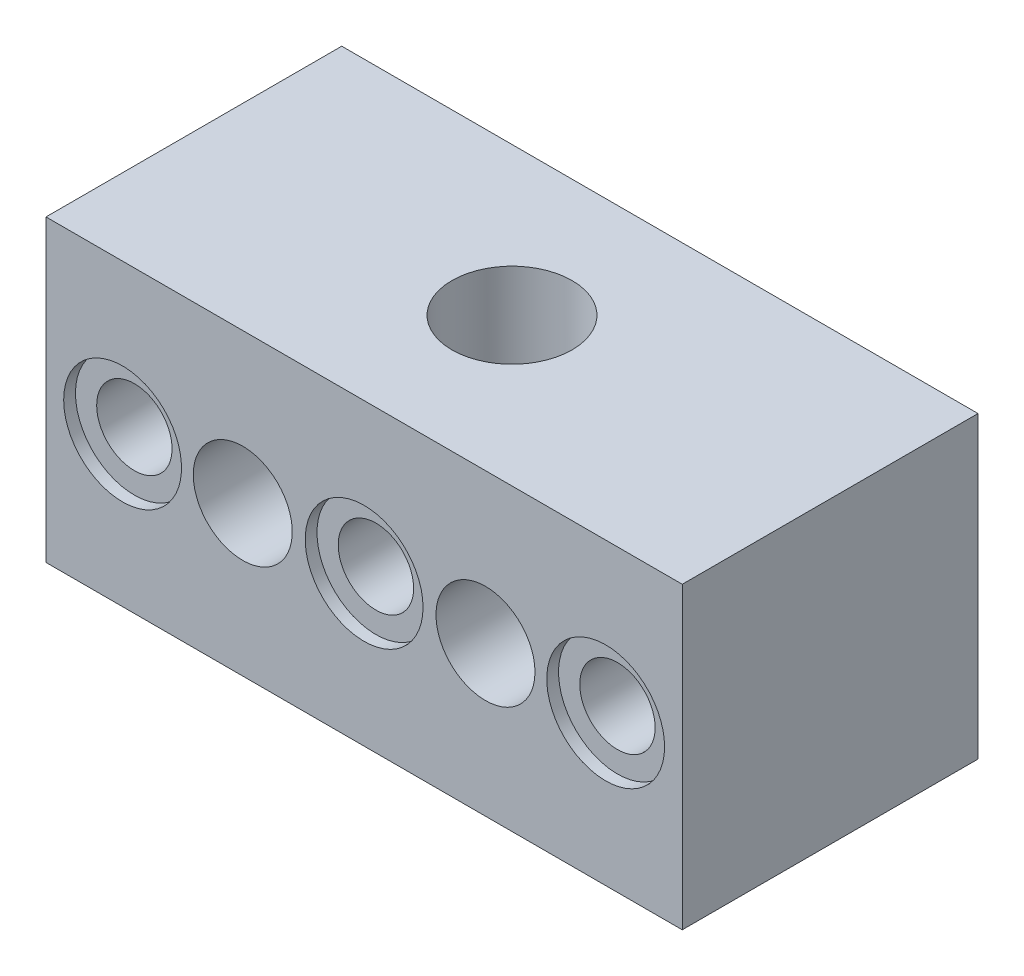
ISO-10303-21;
HEADER;
FILE_DESCRIPTION(('STEP AP214'),'2;1');
FILE_NAME('part.step','',(''),(''),'','','');
FILE_SCHEMA(('AUTOMOTIVE_DESIGN { 1 0 10303 214 1 1 1 1 }'));
ENDSEC;
DATA;
#1=APPLICATION_CONTEXT('core data for automotive mechanical design processes');
#2=APPLICATION_PROTOCOL_DEFINITION('international standard','automotive_design',2000,#1);
#3=PRODUCT_CONTEXT('',#1,'mechanical');
#4=PRODUCT('Part','Part','',(#3));
#5=PRODUCT_RELATED_PRODUCT_CATEGORY('part','',(#4));
#6=PRODUCT_DEFINITION_FORMATION('','',#4);
#7=PRODUCT_DEFINITION_CONTEXT('part definition',#1,'design');
#8=PRODUCT_DEFINITION('design','',#6,#7);
#9=PRODUCT_DEFINITION_SHAPE('','',#8);
#10=(LENGTH_UNIT() NAMED_UNIT(*) SI_UNIT(.MILLI.,.METRE.));
#11=(NAMED_UNIT(*) PLANE_ANGLE_UNIT() SI_UNIT($,.RADIAN.));
#12=(NAMED_UNIT(*) SI_UNIT($,.STERADIAN.) SOLID_ANGLE_UNIT());
#13=UNCERTAINTY_MEASURE_WITH_UNIT(LENGTH_MEASURE(1.E-05),#10,'distance_accuracy_value','');
#14=(GEOMETRIC_REPRESENTATION_CONTEXT(3) GLOBAL_UNCERTAINTY_ASSIGNED_CONTEXT((#13)) GLOBAL_UNIT_ASSIGNED_CONTEXT((#10,
#11,#12)) REPRESENTATION_CONTEXT('',''));
#15=CARTESIAN_POINT('',(0.,0.,0.));
#16=DIRECTION('',(0.,0.,1.));
#17=DIRECTION('',(1.,0.,0.));
#18=AXIS2_PLACEMENT_3D('',#15,#16,#17);
#19=CARTESIAN_POINT('',(0.,0.,-12.55));
#20=DIRECTION('',(0.,0.,1.));
#21=DIRECTION('',(1.,0.,0.));
#22=AXIS2_PLACEMENT_3D('',#19,#20,#21);
#23=CYLINDRICAL_SURFACE('',#22,2.);
#24=CARTESIAN_POINT('',(2.,0.,-4.69148164229596));
#25=CARTESIAN_POINT('',(1.99998868294407,-0.107331527160805,-4.69149190499258));
#26=CARTESIAN_POINT('',(1.99130845931353,-0.214825531204384,-4.69521685162323));
#27=CARTESIAN_POINT('',(1.95690529886903,-0.426741592262692,-4.70965465194673));
#28=CARTESIAN_POINT('',(1.93113779598547,-0.53115486850916,-4.72038577762299));
#29=CARTESIAN_POINT('',(1.86368433406458,-0.73348942458071,-4.74741888303735));
#30=CARTESIAN_POINT('',(1.82205688790874,-0.831433033061049,-4.76370036261289));
#31=CARTESIAN_POINT('',(1.7242353393972,-1.01892137459719,-4.79997107957712));
#32=CARTESIAN_POINT('',(1.66804483796129,-1.10846817643796,-4.81995940005034));
#33=CARTESIAN_POINT('',(1.53938855784149,-1.281594216585,-4.8626219141422));
#34=CARTESIAN_POINT('',(1.46625161521045,-1.36465417687144,-4.88538029304905));
#35=CARTESIAN_POINT('',(1.30719248057609,-1.51770732900037,-4.9303218134644));
#36=CARTESIAN_POINT('',(1.2212659278244,-1.5876960456447,-4.95250475573069));
#37=CARTESIAN_POINT('',(1.03508782493009,-1.71516401056526,-4.99480036084807));
#38=CARTESIAN_POINT('',(0.934418656167721,-1.77207287368724,-5.01480359223439));
#39=CARTESIAN_POINT('',(0.724011817736552,-1.86792827658748,-5.04947027049336));
#40=CARTESIAN_POINT('',(0.614277722882891,-1.90688185765342,-5.06413581010314));
#41=CARTESIAN_POINT('',(0.394296302938079,-1.96388137626348,-5.08587928803576));
#42=CARTESIAN_POINT('',(0.284312625478473,-1.98281932757034,-5.09327979234115));
#43=CARTESIAN_POINT('',(0.0624960996866547,-2.00211777551243,-5.10082260659717));
#44=CARTESIAN_POINT('',(-0.0493360723678362,-2.002484922169,-5.1009675147048));
#45=CARTESIAN_POINT('',(-0.265244397565637,-1.98513018349094,-5.09418197279688));
#46=CARTESIAN_POINT('',(-0.369413163792085,-1.96838449155716,-5.08763334803136));
#47=CARTESIAN_POINT('',(-0.573324970423759,-1.91893396861578,-5.0687067807809));
#48=CARTESIAN_POINT('',(-0.673067686619219,-1.88622797060826,-5.05632841203385));
#49=CARTESIAN_POINT('',(-0.867073247446061,-1.80537987200519,-5.02672510845319));
#50=CARTESIAN_POINT('',(-0.961231976251247,-1.75701448414259,-5.00943053749082));
#51=CARTESIAN_POINT('',(-1.14033744605734,-1.6464258295747,-4.97172199977939));
#52=CARTESIAN_POINT('',(-1.22528107030746,-1.5841978958463,-4.95130698321618));
#53=CARTESIAN_POINT('',(-1.38925998094188,-1.4430482235682,-4.90791218815722));
#54=CARTESIAN_POINT('',(-1.46757929571857,-1.36331825468459,-4.8848518630633));
#55=CARTESIAN_POINT('',(-1.61002157465662,-1.19174982368722,-4.83977527079559));
#56=CARTESIAN_POINT('',(-1.67414025179845,-1.09990771836404,-4.81775932047925));
#57=CARTESIAN_POINT('',(-1.78791056883542,-0.903642216809712,-4.77672905622578));
#58=CARTESIAN_POINT('',(-1.83713849403592,-0.798951945351058,-4.75780865273447));
#59=CARTESIAN_POINT('',(-1.91698539446833,-0.581828215474679,-4.72620704743673));
#60=CARTESIAN_POINT('',(-1.94761589932275,-0.46939960274362,-4.71352198091306));
#61=CARTESIAN_POINT('',(-1.98769301802243,-0.247113567350298,-4.69675670897121));
#62=CARTESIAN_POINT('',(-1.99828740977897,-0.137498588992224,-4.69221113144169));
#63=CARTESIAN_POINT('',(-2.00132774366452,0.0820131950800572,-4.6909162055166));
#64=CARTESIAN_POINT('',(-1.99377886278772,0.191909911464717,-4.69416463318225));
#65=CARTESIAN_POINT('',(-1.96179069252149,0.402651214593438,-4.70761564154756));
#66=CARTESIAN_POINT('',(-1.93828265431958,0.503664607054172,-4.71743439869375));
#67=CARTESIAN_POINT('',(-1.87623986945062,0.700253130200314,-4.74245026892945));
#68=CARTESIAN_POINT('',(-1.83770187180447,0.795827079205912,-4.75764854554285));
#69=CARTESIAN_POINT('',(-1.74498344049006,0.983044096995232,-4.79244929911338));
#70=CARTESIAN_POINT('',(-1.69024357960678,1.07438124343816,-4.8122024559605));
#71=CARTESIAN_POINT('',(-1.56725447396231,1.24697750470173,-4.85365014102031));
#72=CARTESIAN_POINT('',(-1.49899989868237,1.3282326222986,-4.8753454334007));
#73=CARTESIAN_POINT('',(-1.34523607964226,1.48430655128741,-4.92007950698364));
#74=CARTESIAN_POINT('',(-1.25884983966185,1.55826825021946,-4.94310522156386));
#75=CARTESIAN_POINT('',(-1.07433650791887,1.69076875594337,-4.9864587903578));
#76=CARTESIAN_POINT('',(-0.976209091868441,1.74930713660464,-5.00678657002262));
#77=CARTESIAN_POINT('',(-0.770794259812777,1.84902293904313,-5.04249098344998));
#78=CARTESIAN_POINT('',(-0.663519582451274,1.89022404507421,-5.05787436486452));
#79=CARTESIAN_POINT('',(-0.442813401403255,1.95373580715787,-5.0819494679434));
#80=CARTESIAN_POINT('',(-0.32938512717185,1.97605627179124,-5.0906446639379));
#81=CARTESIAN_POINT('',(-0.107303036580069,2.00004175556764,-5.1000056753124));
#82=CARTESIAN_POINT('',(0.00120087864374591,2.0029204055287,-5.10114319093159));
#83=CARTESIAN_POINT('',(0.217088154673384,1.99111889061257,-5.09652075232563));
#84=CARTESIAN_POINT('',(0.324471671719407,1.97644120790183,-5.09076177314727));
#85=CARTESIAN_POINT('',(0.531926712803004,1.93080729294376,-5.0732231752267));
#86=CARTESIAN_POINT('',(0.632119562125606,1.90032918647124,-5.06162066271493));
#87=CARTESIAN_POINT('',(0.82596011567325,1.82445317703445,-5.03362592455541));
#88=CARTESIAN_POINT('',(0.91960658685429,1.7790524724553,-5.01723279956735));
#89=CARTESIAN_POINT('',(1.10217876099081,1.67238266764866,-4.98038692972038));
#90=CARTESIAN_POINT('',(1.19072059473513,1.61050798670954,-4.95978834290144));
#91=CARTESIAN_POINT('',(1.35652898984138,1.47356716799083,-4.9170289361656));
#92=CARTESIAN_POINT('',(1.43379112620366,1.39849587853038,-4.89486750817877));
#93=CARTESIAN_POINT('',(1.57955379086658,1.2320539533079,-4.84986296767393));
#94=CARTESIAN_POINT('',(1.64726880026457,1.13998313142366,-4.82705674018374));
#95=CARTESIAN_POINT('',(1.76633116568977,0.94504331183851,-4.78477634630386));
#96=CARTESIAN_POINT('',(1.81767632497243,0.842172867347297,-4.76530262728092));
#97=CARTESIAN_POINT('',(1.89850491661755,0.637724461783185,-4.73364531877403));
#98=CARTESIAN_POINT('',(1.92950879423484,0.536821861378337,-4.72097274098538));
#99=CARTESIAN_POINT('',(1.97521941832933,0.330990262028884,-4.70203619691373));
#100=CARTESIAN_POINT('',(1.98997215188218,0.226073498569593,-4.69575415074687));
#101=CARTESIAN_POINT('',(1.9987879428241,0.0805247888119468,-4.69199695441099));
#102=CARTESIAN_POINT('',(2.00000424648029,0.0402738324794917,-4.69147779144118));
#103=CARTESIAN_POINT('',(2.,0.,-4.69148164229596));
#104=B_SPLINE_CURVE_WITH_KNOTS('',3,(#24,#25,#26,#27,#28,#29,#30,#31,#32,#33,#34,#35,#36,#37,
#38,#39,#40,#41,#42,#43,#44,#45,#46,#47,#48,#49,#50,#51,#52,#53,#54,#55,#56,#57,#58,#59,#60,#61,
#62,#63,#64,#65,#66,#67,#68,#69,#70,#71,#72,#73,#74,#75,#76,#77,#78,#79,#80,#81,#82,#83,#84,#85,
#86,#87,#88,#89,#90,#91,#92,#93,#94,#95,#96,#97,#98,#99,#100,#101,#102,#103),.UNSPECIFIED.,.T.,
.F.,(4,2,2,2,2,2,2,2,2,2,2,2,2,2,2,2,2,2,2,2,2,2,2,2,2,2,2,2,2,2,2,2,2,2,2,2,2,2,2,4),(0.,
0.321873118007116,0.644589046409371,0.966125714661647,1.28758295418594,1.62504906019072,
1.96263049341685,2.3129255336373,2.66308308612496,2.99687651402516,3.33055041295608,
3.64619748634823,3.96186764296412,4.28225330021832,4.6027469833052,4.94355894733683,
5.28447365900743,5.6343330458018,5.9839753123505,6.3128980344958,6.64172691310554,
6.95285184348961,7.2640441075293,7.58756997964854,7.91122371302847,8.25768589219792,
8.60415764276125,8.95015453343389,9.29597156653151,9.61998414605211,9.94395092112635,
10.2586417715133,10.5733917367164,10.9018654237185,11.2304676259244,11.5784506402441,
11.9264803323489,12.2440397048368,12.560698128854,12.6814740497524),.UNSPECIFIED.);
#105=CARTESIAN_POINT('',(2.,0.,-4.69148164229596));
#106=VERTEX_POINT('',#105);
#107=EDGE_CURVE('E246',#106,#106,#104,.T.);
#108=ORIENTED_EDGE('',*,*,#107,.F.);
#109=EDGE_LOOP('',(#108));
#110=FACE_BOUND('',#109,.T.);
#111=CARTESIAN_POINT('',(0.,0.,-6.95));
#112=DIRECTION('',(0.,0.,-1.));
#113=DIRECTION('',(-1.,0.,0.));
#114=AXIS2_PLACEMENT_3D('',#111,#112,#113);
#115=CIRCLE('',#114,2.);
#116=CARTESIAN_POINT('',(-2.,0.,-6.95));
#117=VERTEX_POINT('',#116);
#118=EDGE_CURVE('E51',#117,#117,#115,.F.);
#119=ORIENTED_EDGE('',*,*,#118,.F.);
#120=EDGE_LOOP('',(#119));
#121=FACE_BOUND('',#120,.T.);
#122=ADVANCED_FACE('F47',(#110,#121),#23,.F.);
#123=CARTESIAN_POINT('',(0.,0.,-11.55));
#124=DIRECTION('',(0.,0.,-1.));
#125=DIRECTION('',(1.,0.,0.));
#126=AXIS2_PLACEMENT_3D('',#123,#124,#125);
#127=PLANE('',#126);
#128=CARTESIAN_POINT('',(0.,0.,-11.55));
#129=DIRECTION('',(0.,0.,1.));
#130=DIRECTION('',(1.,0.,0.));
#131=AXIS2_PLACEMENT_3D('',#128,#129,#130);
#132=CIRCLE('',#131,5.);
#133=CARTESIAN_POINT('',(5.,0.,-11.55));
#134=VERTEX_POINT('',#133);
#135=EDGE_CURVE('E251',#134,#134,#132,.T.);
#136=ORIENTED_EDGE('',*,*,#135,.F.);
#137=EDGE_LOOP('',(#136));
#138=FACE_BOUND('',#137,.T.);
#139=CARTESIAN_POINT('',(0.,0.,-11.55));
#140=DIRECTION('',(0.,0.,1.));
#141=DIRECTION('',(1.,0.,0.));
#142=AXIS2_PLACEMENT_3D('',#139,#140,#141);
#143=CIRCLE('',#142,3.2);
#144=CARTESIAN_POINT('',(3.2,0.,-11.55));
#145=VERTEX_POINT('',#144);
#146=EDGE_CURVE('E390',#145,#145,#143,.T.);
#147=ORIENTED_EDGE('',*,*,#146,.T.);
#148=EDGE_LOOP('',(#147));
#149=FACE_BOUND('',#148,.T.);
#150=ADVANCED_FACE('F211',(#138,#149),#127,.T.);
#151=CARTESIAN_POINT('',(0.,0.,-12.55));
#152=DIRECTION('',(0.,0.,-1.));
#153=DIRECTION('',(-1.,0.,0.));
#154=AXIS2_PLACEMENT_3D('',#151,#152,#153);
#155=PLANE('',#154);
#156=CARTESIAN_POINT('',(-20.5,0.,-12.55));
#157=DIRECTION('',(0.,0.,1.));
#158=DIRECTION('',(-1.,0.,0.));
#159=AXIS2_PLACEMENT_3D('',#156,#157,#158);
#160=CIRCLE('',#159,5.);
#161=CARTESIAN_POINT('',(-25.5,0.,-12.55));
#162=VERTEX_POINT('',#161);
#163=EDGE_CURVE('E127',#162,#162,#160,.T.);
#164=ORIENTED_EDGE('',*,*,#163,.T.);
#165=EDGE_LOOP('',(#164));
#166=FACE_BOUND('',#165,.T.);
#167=DIRECTION('',(0.,-1.,0.));
#168=VECTOR('',#167,1.);
#169=CARTESIAN_POINT('',(-27.,12.7,-12.55));
#170=LINE('',#169,#168);
#171=CARTESIAN_POINT('',(-27.,12.7,-12.55));
#172=VERTEX_POINT('',#171);
#173=CARTESIAN_POINT('',(-27.,-12.7,-12.55));
#174=VERTEX_POINT('',#173);
#175=EDGE_CURVE('E90',#172,#174,#170,.T.);
#176=ORIENTED_EDGE('',*,*,#175,.F.);
#177=DIRECTION('',(-1.,0.,0.));
#178=VECTOR('',#177,1.);
#179=CARTESIAN_POINT('',(27.,12.7,-12.55));
#180=LINE('',#179,#178);
#181=CARTESIAN_POINT('',(27.,12.7,-12.55));
#182=VERTEX_POINT('',#181);
#183=EDGE_CURVE('E95',#182,#172,#180,.T.);
#184=ORIENTED_EDGE('',*,*,#183,.F.);
#185=DIRECTION('',(0.,1.,0.));
#186=VECTOR('',#185,1.);
#187=CARTESIAN_POINT('',(27.,12.7,-12.55));
#188=LINE('',#187,#186);
#189=CARTESIAN_POINT('',(27.,-12.7,-12.55));
#190=VERTEX_POINT('',#189);
#191=EDGE_CURVE('E120',#190,#182,#188,.T.);
#192=ORIENTED_EDGE('',*,*,#191,.F.);
#193=DIRECTION('',(1.,0.,0.));
#194=VECTOR('',#193,1.);
#195=CARTESIAN_POINT('',(27.,-12.7,-12.55));
#196=LINE('',#195,#194);
#197=EDGE_CURVE('E118',#174,#190,#196,.T.);
#198=ORIENTED_EDGE('',*,*,#197,.F.);
#199=EDGE_LOOP('',(#176,#184,#192,#198));
#200=FACE_BOUND('',#199,.T.);
#201=CARTESIAN_POINT('',(20.5,0.,-12.55));
#202=DIRECTION('',(0.,0.,1.));
#203=DIRECTION('',(1.,0.,0.));
#204=AXIS2_PLACEMENT_3D('',#201,#202,#203);
#205=CIRCLE('',#204,5.);
#206=CARTESIAN_POINT('',(25.5,0.,-12.55));
#207=VERTEX_POINT('',#206);
#208=EDGE_CURVE('E154',#207,#207,#205,.T.);
#209=ORIENTED_EDGE('',*,*,#208,.T.);
#210=EDGE_LOOP('',(#209));
#211=FACE_BOUND('',#210,.T.);
#212=CARTESIAN_POINT('',(10.3,0.,-12.55));
#213=DIRECTION('',(0.,0.,-1.));
#214=DIRECTION('',(-1.,0.,0.));
#215=AXIS2_PLACEMENT_3D('',#212,#213,#214);
#216=CIRCLE('',#215,4.2);
#217=CARTESIAN_POINT('',(6.1,0.,-12.55));
#218=VERTEX_POINT('',#217);
#219=EDGE_CURVE('E146',#218,#218,#216,.F.);
#220=ORIENTED_EDGE('',*,*,#219,.T.);
#221=EDGE_LOOP('',(#220));
#222=FACE_BOUND('',#221,.T.);
#223=CARTESIAN_POINT('',(-10.3,0.,-12.55));
#224=DIRECTION('',(0.,0.,-1.));
#225=DIRECTION('',(-1.,0.,0.));
#226=AXIS2_PLACEMENT_3D('',#223,#224,#225);
#227=CIRCLE('',#226,4.2);
#228=CARTESIAN_POINT('',(-14.5,0.,-12.55));
#229=VERTEX_POINT('',#228);
#230=EDGE_CURVE('E363',#229,#229,#227,.F.);
#231=ORIENTED_EDGE('',*,*,#230,.T.);
#232=EDGE_LOOP('',(#231));
#233=FACE_BOUND('',#232,.T.);
#234=CARTESIAN_POINT('',(0.,0.,-12.55));
#235=DIRECTION('',(0.,0.,1.));
#236=DIRECTION('',(1.,0.,0.));
#237=AXIS2_PLACEMENT_3D('',#234,#235,#236);
#238=CIRCLE('',#237,5.);
#239=CARTESIAN_POINT('',(5.,0.,-12.55));
#240=VERTEX_POINT('',#239);
#241=EDGE_CURVE('E383',#240,#240,#238,.T.);
#242=ORIENTED_EDGE('',*,*,#241,.T.);
#243=EDGE_LOOP('',(#242));
#244=FACE_BOUND('',#243,.T.);
#245=ADVANCED_FACE('F218',(#166,#200,#211,#222,#233,#244),#155,.T.);
#246=CARTESIAN_POINT('',(-20.5,0.,-11.55));
#247=DIRECTION('',(0.,0.,1.));
#248=DIRECTION('',(-1.,0.,0.));
#249=AXIS2_PLACEMENT_3D('',#246,#247,#248);
#250=PLANE('',#249);
#251=CARTESIAN_POINT('',(-20.5,0.,-11.55));
#252=DIRECTION('',(0.,0.,1.));
#253=DIRECTION('',(-1.,0.,0.));
#254=AXIS2_PLACEMENT_3D('',#251,#252,#253);
#255=CIRCLE('',#254,5.);
#256=CARTESIAN_POINT('',(-25.5,0.,-11.55));
#257=VERTEX_POINT('',#256);
#258=EDGE_CURVE('E151',#257,#257,#255,.T.);
#259=ORIENTED_EDGE('',*,*,#258,.F.);
#260=EDGE_LOOP('',(#259));
#261=FACE_BOUND('',#260,.T.);
#262=CARTESIAN_POINT('',(-20.5,0.,-11.55));
#263=DIRECTION('',(0.,0.,1.));
#264=DIRECTION('',(-1.,0.,0.));
#265=AXIS2_PLACEMENT_3D('',#262,#263,#264);
#266=CIRCLE('',#265,3.2);
#267=CARTESIAN_POINT('',(-23.7,0.,-11.55));
#268=VERTEX_POINT('',#267);
#269=EDGE_CURVE('E138',#268,#268,#266,.T.);
#270=ORIENTED_EDGE('',*,*,#269,.T.);
#271=EDGE_LOOP('',(#270));
#272=FACE_BOUND('',#271,.T.);
#273=ADVANCED_FACE('F298',(#261,#272),#250,.F.);
#274=CARTESIAN_POINT('',(20.5,0.,-12.551));
#275=DIRECTION('',(0.,0.,1.));
#276=DIRECTION('',(1.,0.,0.));
#277=AXIS2_PLACEMENT_3D('',#274,#275,#276);
#278=CYLINDRICAL_SURFACE('',#277,2.);
#279=CARTESIAN_POINT('',(20.5,0.,6.95));
#280=DIRECTION('',(0.,0.,1.));
#281=DIRECTION('',(1.,0.,0.));
#282=AXIS2_PLACEMENT_3D('',#279,#280,#281);
#283=CIRCLE('',#282,2.);
#284=CARTESIAN_POINT('',(22.5,0.,6.95));
#285=VERTEX_POINT('',#284);
#286=EDGE_CURVE('E165',#285,#285,#283,.T.);
#287=ORIENTED_EDGE('',*,*,#286,.T.);
#288=EDGE_LOOP('',(#287));
#289=FACE_BOUND('',#288,.T.);
#290=CARTESIAN_POINT('',(20.5,0.,-6.95));
#291=DIRECTION('',(0.,0.,-1.));
#292=DIRECTION('',(-1.,0.,0.));
#293=AXIS2_PLACEMENT_3D('',#290,#291,#292);
#294=CIRCLE('',#293,2.);
#295=CARTESIAN_POINT('',(18.5,0.,-6.95));
#296=VERTEX_POINT('',#295);
#297=EDGE_CURVE('E125',#296,#296,#294,.F.);
#298=ORIENTED_EDGE('',*,*,#297,.F.);
#299=EDGE_LOOP('',(#298));
#300=FACE_BOUND('',#299,.T.);
#301=ADVANCED_FACE('F294',(#289,#300),#278,.F.);
#302=CARTESIAN_POINT('',(20.5,0.,-11.55));
#303=DIRECTION('',(0.,0.,-1.));
#304=DIRECTION('',(1.,0.,0.));
#305=AXIS2_PLACEMENT_3D('',#302,#303,#304);
#306=PLANE('',#305);
#307=CARTESIAN_POINT('',(20.5,0.,-11.55));
#308=DIRECTION('',(0.,0.,1.));
#309=DIRECTION('',(1.,0.,0.));
#310=AXIS2_PLACEMENT_3D('',#307,#308,#309);
#311=CIRCLE('',#310,5.);
#312=CARTESIAN_POINT('',(25.5,0.,-11.55));
#313=VERTEX_POINT('',#312);
#314=EDGE_CURVE('E157',#313,#313,#311,.T.);
#315=ORIENTED_EDGE('',*,*,#314,.F.);
#316=EDGE_LOOP('',(#315));
#317=FACE_BOUND('',#316,.T.);
#318=CARTESIAN_POINT('',(20.5,0.,-11.55));
#319=DIRECTION('',(0.,0.,1.));
#320=DIRECTION('',(1.,0.,0.));
#321=AXIS2_PLACEMENT_3D('',#318,#319,#320);
#322=CIRCLE('',#321,3.2);
#323=CARTESIAN_POINT('',(23.7,0.,-11.55));
#324=VERTEX_POINT('',#323);
#325=EDGE_CURVE('E131',#324,#324,#322,.T.);
#326=ORIENTED_EDGE('',*,*,#325,.T.);
#327=EDGE_LOOP('',(#326));
#328=FACE_BOUND('',#327,.T.);
#329=ADVANCED_FACE('F297',(#317,#328),#306,.T.);
#330=CARTESIAN_POINT('',(-27.,12.7,-12.55));
#331=DIRECTION('',(-1.,0.,0.));
#332=DIRECTION('',(0.,0.,1.));
#333=AXIS2_PLACEMENT_3D('',#330,#331,#332);
#334=PLANE('',#333);
#335=DIRECTION('',(0.,0.,1.));
#336=VECTOR('',#335,1.);
#337=CARTESIAN_POINT('',(-27.,-12.7,-12.55));
#338=LINE('',#337,#336);
#339=CARTESIAN_POINT('',(-27.,-12.7,12.55));
#340=VERTEX_POINT('',#339);
#341=EDGE_CURVE('E86',#174,#340,#338,.T.);
#342=ORIENTED_EDGE('',*,*,#341,.T.);
#343=DIRECTION('',(0.,-1.,0.));
#344=VECTOR('',#343,1.);
#345=CARTESIAN_POINT('',(-27.,12.7,12.55));
#346=LINE('',#345,#344);
#347=CARTESIAN_POINT('',(-27.,12.7,12.55));
#348=VERTEX_POINT('',#347);
#349=EDGE_CURVE('E89',#348,#340,#346,.T.);
#350=ORIENTED_EDGE('',*,*,#349,.F.);
#351=DIRECTION('',(0.,0.,1.));
#352=VECTOR('',#351,1.);
#353=CARTESIAN_POINT('',(-27.,12.7,-12.55));
#354=LINE('',#353,#352);
#355=EDGE_CURVE('E13',#172,#348,#354,.T.);
#356=ORIENTED_EDGE('',*,*,#355,.F.);
#357=ORIENTED_EDGE('',*,*,#175,.T.);
#358=EDGE_LOOP('',(#342,#350,#356,#357));
#359=FACE_BOUND('',#358,.T.);
#360=ADVANCED_FACE('F49',(#359),#334,.T.);
#361=CARTESIAN_POINT('',(27.,12.7,-12.55));
#362=DIRECTION('',(0.,1.,0.));
#363=DIRECTION('',(-1.,0.,0.));
#364=AXIS2_PLACEMENT_3D('',#361,#362,#363);
#365=PLANE('',#364);
#366=CARTESIAN_POINT('',(0.,12.7,0.));
#367=DIRECTION('',(0.,1.,0.));
#368=DIRECTION('',(-1.,0.,0.));
#369=AXIS2_PLACEMENT_3D('',#366,#367,#368);
#370=CIRCLE('',#369,5.1);
#371=CARTESIAN_POINT('',(-5.1,12.7,0.));
#372=VERTEX_POINT('',#371);
#373=EDGE_CURVE('E111',#372,#372,#370,.F.);
#374=ORIENTED_EDGE('',*,*,#373,.T.);
#375=EDGE_LOOP('',(#374));
#376=FACE_BOUND('',#375,.T.);
#377=ORIENTED_EDGE('',*,*,#355,.T.);
#378=DIRECTION('',(-1.,0.,0.));
#379=VECTOR('',#378,1.);
#380=CARTESIAN_POINT('',(27.,12.7,12.55));
#381=LINE('',#380,#379);
#382=CARTESIAN_POINT('',(27.,12.7,12.55));
#383=VERTEX_POINT('',#382);
#384=EDGE_CURVE('E107',#383,#348,#381,.T.);
#385=ORIENTED_EDGE('',*,*,#384,.F.);
#386=DIRECTION('',(0.,0.,1.));
#387=VECTOR('',#386,1.);
#388=CARTESIAN_POINT('',(27.,12.7,-12.55));
#389=LINE('',#388,#387);
#390=EDGE_CURVE('E56',#182,#383,#389,.T.);
#391=ORIENTED_EDGE('',*,*,#390,.F.);
#392=ORIENTED_EDGE('',*,*,#183,.T.);
#393=EDGE_LOOP('',(#377,#385,#391,#392));
#394=FACE_BOUND('',#393,.T.);
#395=ADVANCED_FACE('F605',(#376,#394),#365,.T.);
#396=CARTESIAN_POINT('',(27.,12.7,-12.55));
#397=DIRECTION('',(1.,0.,0.));
#398=DIRECTION('',(0.,0.,-1.));
#399=AXIS2_PLACEMENT_3D('',#396,#397,#398);
#400=PLANE('',#399);
#401=ORIENTED_EDGE('',*,*,#390,.T.);
#402=DIRECTION('',(0.,1.,0.));
#403=VECTOR('',#402,1.);
#404=CARTESIAN_POINT('',(27.,12.7,12.55));
#405=LINE('',#404,#403);
#406=CARTESIAN_POINT('',(27.,-12.7,12.55));
#407=VERTEX_POINT('',#406);
#408=EDGE_CURVE('E103',#407,#383,#405,.T.);
#409=ORIENTED_EDGE('',*,*,#408,.F.);
#410=DIRECTION('',(0.,0.,1.));
#411=VECTOR('',#410,1.);
#412=CARTESIAN_POINT('',(27.,-12.7,-12.55));
#413=LINE('',#412,#411);
#414=EDGE_CURVE('E94',#190,#407,#413,.T.);
#415=ORIENTED_EDGE('',*,*,#414,.F.);
#416=ORIENTED_EDGE('',*,*,#191,.T.);
#417=EDGE_LOOP('',(#401,#409,#415,#416));
#418=FACE_BOUND('',#417,.T.);
#419=ADVANCED_FACE('F205',(#418),#400,.T.);
#420=CARTESIAN_POINT('',(27.,-12.7,-12.55));
#421=DIRECTION('',(0.,-1.,0.));
#422=DIRECTION('',(1.,0.,0.));
#423=AXIS2_PLACEMENT_3D('',#420,#421,#422);
#424=PLANE('',#423);
#425=CARTESIAN_POINT('',(0.,-12.7,0.));
#426=DIRECTION('',(0.,-1.,0.));
#427=DIRECTION('',(1.,0.,0.));
#428=AXIS2_PLACEMENT_3D('',#425,#426,#427);
#429=CIRCLE('',#428,5.1);
#430=CARTESIAN_POINT('',(5.1,-12.7,0.));
#431=VERTEX_POINT('',#430);
#432=EDGE_CURVE('E108',#431,#431,#429,.T.);
#433=ORIENTED_EDGE('',*,*,#432,.F.);
#434=EDGE_LOOP('',(#433));
#435=FACE_BOUND('',#434,.T.);
#436=ORIENTED_EDGE('',*,*,#414,.T.);
#437=DIRECTION('',(1.,0.,0.));
#438=VECTOR('',#437,1.);
#439=CARTESIAN_POINT('',(27.,-12.7,12.55));
#440=LINE('',#439,#438);
#441=EDGE_CURVE('E98',#340,#407,#440,.T.);
#442=ORIENTED_EDGE('',*,*,#441,.F.);
#443=ORIENTED_EDGE('',*,*,#341,.F.);
#444=ORIENTED_EDGE('',*,*,#197,.T.);
#445=EDGE_LOOP('',(#436,#442,#443,#444));
#446=FACE_BOUND('',#445,.T.);
#447=ADVANCED_FACE('F99',(#435,#446),#424,.T.);
#448=CARTESIAN_POINT('',(0.,0.,12.55));
#449=DIRECTION('',(0.,0.,-1.));
#450=DIRECTION('',(-1.,0.,0.));
#451=AXIS2_PLACEMENT_3D('',#448,#449,#450);
#452=PLANE('',#451);
#453=CARTESIAN_POINT('',(0.,0.,12.55));
#454=DIRECTION('',(0.,0.,1.));
#455=DIRECTION('',(1.,0.,0.));
#456=AXIS2_PLACEMENT_3D('',#453,#454,#455);
#457=CIRCLE('',#456,5.);
#458=CARTESIAN_POINT('',(5.,0.,12.55));
#459=VERTEX_POINT('',#458);
#460=EDGE_CURVE('E358',#459,#459,#457,.T.);
#461=ORIENTED_EDGE('',*,*,#460,.F.);
#462=EDGE_LOOP('',(#461));
#463=FACE_BOUND('',#462,.T.);
#464=CARTESIAN_POINT('',(-10.3,0.,12.55));
#465=DIRECTION('',(0.,0.,1.));
#466=DIRECTION('',(-1.,0.,0.));
#467=AXIS2_PLACEMENT_3D('',#464,#465,#466);
#468=CIRCLE('',#467,4.2);
#469=CARTESIAN_POINT('',(-14.5,0.,12.55));
#470=VERTEX_POINT('',#469);
#471=EDGE_CURVE('E366',#470,#470,#468,.T.);
#472=ORIENTED_EDGE('',*,*,#471,.F.);
#473=EDGE_LOOP('',(#472));
#474=FACE_BOUND('',#473,.T.);
#475=CARTESIAN_POINT('',(10.3,0.,12.55));
#476=DIRECTION('',(0.,0.,1.));
#477=DIRECTION('',(1.,0.,0.));
#478=AXIS2_PLACEMENT_3D('',#475,#476,#477);
#479=CIRCLE('',#478,4.2);
#480=CARTESIAN_POINT('',(14.5,0.,12.55));
#481=VERTEX_POINT('',#480);
#482=EDGE_CURVE('E143',#481,#481,#479,.T.);
#483=ORIENTED_EDGE('',*,*,#482,.F.);
#484=EDGE_LOOP('',(#483));
#485=FACE_BOUND('',#484,.T.);
#486=CARTESIAN_POINT('',(-20.5,0.,12.55));
#487=DIRECTION('',(0.,0.,1.));
#488=DIRECTION('',(-1.,0.,0.));
#489=AXIS2_PLACEMENT_3D('',#486,#487,#488);
#490=CIRCLE('',#489,5.);
#491=CARTESIAN_POINT('',(-25.5,0.,12.55));
#492=VERTEX_POINT('',#491);
#493=EDGE_CURVE('E178',#492,#492,#490,.T.);
#494=ORIENTED_EDGE('',*,*,#493,.F.);
#495=EDGE_LOOP('',(#494));
#496=FACE_BOUND('',#495,.T.);
#497=CARTESIAN_POINT('',(20.5,0.,12.55));
#498=DIRECTION('',(0.,0.,1.));
#499=DIRECTION('',(1.,0.,0.));
#500=AXIS2_PLACEMENT_3D('',#497,#498,#499);
#501=CIRCLE('',#500,5.);
#502=CARTESIAN_POINT('',(25.5,0.,12.55));
#503=VERTEX_POINT('',#502);
#504=EDGE_CURVE('E184',#503,#503,#501,.T.);
#505=ORIENTED_EDGE('',*,*,#504,.F.);
#506=EDGE_LOOP('',(#505));
#507=FACE_BOUND('',#506,.T.);
#508=ORIENTED_EDGE('',*,*,#349,.T.);
#509=ORIENTED_EDGE('',*,*,#441,.T.);
#510=ORIENTED_EDGE('',*,*,#408,.T.);
#511=ORIENTED_EDGE('',*,*,#384,.T.);
#512=EDGE_LOOP('',(#508,#509,#510,#511));
#513=FACE_BOUND('',#512,.T.);
#514=ADVANCED_FACE('F106',(#463,#474,#485,#496,#507,#513),#452,.F.);
#515=CARTESIAN_POINT('',(0.,12.701,0.));
#516=DIRECTION('',(0.,-1.,0.));
#517=DIRECTION('',(1.,0.,0.));
#518=AXIS2_PLACEMENT_3D('',#515,#516,#517);
#519=CYLINDRICAL_SURFACE('',#518,5.1);
#520=ORIENTED_EDGE('',*,*,#107,.T.);
#521=EDGE_LOOP('',(#520));
#522=FACE_BOUND('',#521,.T.);
#523=CARTESIAN_POINT('',(2.,0.,4.69148164229596));
#524=CARTESIAN_POINT('',(1.99998868294407,0.107331527160805,4.69149190499258));
#525=CARTESIAN_POINT('',(1.99130845931353,0.214825531204384,4.69521685162323));
#526=CARTESIAN_POINT('',(1.95690529886903,0.426741592262692,4.70965465194673));
#527=CARTESIAN_POINT('',(1.93113779598547,0.53115486850916,4.72038577762299));
#528=CARTESIAN_POINT('',(1.86368433406458,0.73348942458071,4.74741888303735));
#529=CARTESIAN_POINT('',(1.82205688790874,0.831433033061049,4.76370036261289));
#530=CARTESIAN_POINT('',(1.7242353393972,1.01892137459719,4.79997107957712));
#531=CARTESIAN_POINT('',(1.66804483796129,1.10846817643796,4.81995940005034));
#532=CARTESIAN_POINT('',(1.53938855784149,1.281594216585,4.8626219141422));
#533=CARTESIAN_POINT('',(1.46625161521045,1.36465417687144,4.88538029304905));
#534=CARTESIAN_POINT('',(1.30719248057609,1.51770732900037,4.9303218134644));
#535=CARTESIAN_POINT('',(1.2212659278244,1.5876960456447,4.95250475573069));
#536=CARTESIAN_POINT('',(1.03508782493009,1.71516401056526,4.99480036084807));
#537=CARTESIAN_POINT('',(0.934418656167721,1.77207287368724,5.01480359223439));
#538=CARTESIAN_POINT('',(0.724011817736552,1.86792827658748,5.04947027049336));
#539=CARTESIAN_POINT('',(0.614277722882891,1.90688185765342,5.06413581010314));
#540=CARTESIAN_POINT('',(0.394296302938079,1.96388137626348,5.08587928803576));
#541=CARTESIAN_POINT('',(0.284312625478473,1.98281932757034,5.09327979234115));
#542=CARTESIAN_POINT('',(0.0624960996866547,2.00211777551243,5.10082260659717));
#543=CARTESIAN_POINT('',(-0.0493360723678362,2.002484922169,5.1009675147048));
#544=CARTESIAN_POINT('',(-0.265244397565637,1.98513018349094,5.09418197279688));
#545=CARTESIAN_POINT('',(-0.369413163792085,1.96838449155716,5.08763334803136));
#546=CARTESIAN_POINT('',(-0.573324970423759,1.91893396861578,5.0687067807809));
#547=CARTESIAN_POINT('',(-0.673067686619219,1.88622797060826,5.05632841203385));
#548=CARTESIAN_POINT('',(-0.867073247446061,1.80537987200519,5.02672510845319));
#549=CARTESIAN_POINT('',(-0.961231976251247,1.75701448414259,5.00943053749082));
#550=CARTESIAN_POINT('',(-1.14033744605734,1.6464258295747,4.97172199977939));
#551=CARTESIAN_POINT('',(-1.22528107030746,1.5841978958463,4.95130698321618));
#552=CARTESIAN_POINT('',(-1.38925998094188,1.4430482235682,4.90791218815722));
#553=CARTESIAN_POINT('',(-1.46757929571857,1.36331825468459,4.8848518630633));
#554=CARTESIAN_POINT('',(-1.61002157465662,1.19174982368722,4.83977527079559));
#555=CARTESIAN_POINT('',(-1.67414025179845,1.09990771836404,4.81775932047925));
#556=CARTESIAN_POINT('',(-1.78791056883542,0.903642216809713,4.77672905622578));
#557=CARTESIAN_POINT('',(-1.83713849403592,0.798951945351058,4.75780865273447));
#558=CARTESIAN_POINT('',(-1.91698539446833,0.581828215474679,4.72620704743673));
#559=CARTESIAN_POINT('',(-1.94761589932275,0.469399602743621,4.71352198091306));
#560=CARTESIAN_POINT('',(-1.98769301802243,0.247113567350299,4.69675670897121));
#561=CARTESIAN_POINT('',(-1.99828740977897,0.137498588992225,4.69221113144169));
#562=CARTESIAN_POINT('',(-2.00132774366452,-0.0820131950800564,4.6909162055166));
#563=CARTESIAN_POINT('',(-1.99377886278772,-0.191909911464716,4.69416463318225));
#564=CARTESIAN_POINT('',(-1.96179069252149,-0.402651214593438,4.70761564154756));
#565=CARTESIAN_POINT('',(-1.93828265431958,-0.503664607054172,4.71743439869375));
#566=CARTESIAN_POINT('',(-1.87623986945062,-0.700253130200313,4.74245026892945));
#567=CARTESIAN_POINT('',(-1.83770187180447,-0.795827079205912,4.75764854554285));
#568=CARTESIAN_POINT('',(-1.74498344049006,-0.983044096995231,4.79244929911338));
#569=CARTESIAN_POINT('',(-1.69024357960678,-1.07438124343816,4.8122024559605));
#570=CARTESIAN_POINT('',(-1.56725447396231,-1.24697750470173,4.85365014102031));
#571=CARTESIAN_POINT('',(-1.49899989868237,-1.3282326222986,4.8753454334007));
#572=CARTESIAN_POINT('',(-1.34523607964226,-1.48430655128741,4.92007950698364));
#573=CARTESIAN_POINT('',(-1.25884983966185,-1.55826825021946,4.94310522156386));
#574=CARTESIAN_POINT('',(-1.07433650791887,-1.69076875594337,4.9864587903578));
#575=CARTESIAN_POINT('',(-0.976209091868442,-1.74930713660464,5.00678657002262));
#576=CARTESIAN_POINT('',(-0.770794259812778,-1.84902293904313,5.04249098344998));
#577=CARTESIAN_POINT('',(-0.663519582451275,-1.89022404507421,5.05787436486452));
#578=CARTESIAN_POINT('',(-0.442813401403256,-1.95373580715787,5.0819494679434));
#579=CARTESIAN_POINT('',(-0.329385127171851,-1.97605627179124,5.0906446639379));
#580=CARTESIAN_POINT('',(-0.10730303658007,-2.00004175556764,5.1000056753124));
#581=CARTESIAN_POINT('',(0.00120087864374503,-2.0029204055287,5.10114319093159));
#582=CARTESIAN_POINT('',(0.217088154673384,-1.99111889061257,5.09652075232563));
#583=CARTESIAN_POINT('',(0.324471671719406,-1.97644120790183,5.09076177314727));
#584=CARTESIAN_POINT('',(0.531926712803004,-1.93080729294376,5.0732231752267));
#585=CARTESIAN_POINT('',(0.632119562125606,-1.90032918647124,5.06162066271493));
#586=CARTESIAN_POINT('',(0.825960115673249,-1.82445317703445,5.03362592455541));
#587=CARTESIAN_POINT('',(0.91960658685429,-1.7790524724553,5.01723279956735));
#588=CARTESIAN_POINT('',(1.10217876099081,-1.67238266764866,4.98038692972038));
#589=CARTESIAN_POINT('',(1.19072059473513,-1.61050798670954,4.95978834290144));
#590=CARTESIAN_POINT('',(1.35652898984138,-1.47356716799083,4.9170289361656));
#591=CARTESIAN_POINT('',(1.43379112620366,-1.39849587853038,4.89486750817877));
#592=CARTESIAN_POINT('',(1.57955379086658,-1.2320539533079,4.84986296767393));
#593=CARTESIAN_POINT('',(1.64726880026457,-1.13998313142366,4.82705674018374));
#594=CARTESIAN_POINT('',(1.76633116568977,-0.94504331183851,4.78477634630386));
#595=CARTESIAN_POINT('',(1.81767632497243,-0.842172867347298,4.76530262728092));
#596=CARTESIAN_POINT('',(1.89850491661755,-0.637724461783186,4.73364531877403));
#597=CARTESIAN_POINT('',(1.92950879423484,-0.536821861378337,4.72097274098538));
#598=CARTESIAN_POINT('',(1.97521941832933,-0.330990262028884,4.70203619691373));
#599=CARTESIAN_POINT('',(1.98997215188218,-0.226073498569593,4.69575415074687));
#600=CARTESIAN_POINT('',(1.9987879428241,-0.0805247888119468,4.69199695441099));
#601=CARTESIAN_POINT('',(2.00000424648029,-0.0402738324794917,4.69147779144118));
#602=CARTESIAN_POINT('',(2.,0.,4.69148164229596));
#603=B_SPLINE_CURVE_WITH_KNOTS('',3,(#523,#524,#525,#526,#527,#528,#529,#530,#531,#532,#533,
#534,#535,#536,#537,#538,#539,#540,#541,#542,#543,#544,#545,#546,#547,#548,#549,#550,#551,#552,
#553,#554,#555,#556,#557,#558,#559,#560,#561,#562,#563,#564,#565,#566,#567,#568,#569,#570,#571,
#572,#573,#574,#575,#576,#577,#578,#579,#580,#581,#582,#583,#584,#585,#586,#587,#588,#589,#590,
#591,#592,#593,#594,#595,#596,#597,#598,#599,#600,#601,#602),.UNSPECIFIED.,.T.,.F.,(4,2,2,2,2,2,
2,2,2,2,2,2,2,2,2,2,2,2,2,2,2,2,2,2,2,2,2,2,2,2,2,2,2,2,2,2,2,2,2,4),(0.,0.321873118007116,
0.644589046409371,0.966125714661647,1.28758295418594,1.62504906019072,1.96263049341685,
2.3129255336373,2.66308308612496,2.99687651402516,3.33055041295608,3.64619748634823,
3.96186764296412,4.28225330021832,4.6027469833052,4.94355894733683,5.28447365900743,
5.6343330458018,5.98397531235049,6.3128980344958,6.64172691310554,6.95285184348961,
7.2640441075293,7.58756997964854,7.91122371302847,8.25768589219792,8.60415764276124,
8.95015453343389,9.29597156653151,9.61998414605211,9.94395092112635,10.2586417715133,
10.5733917367164,10.9018654237185,11.2304676259244,11.5784506402441,11.9264803323489,
12.2440397048368,12.560698128854,12.6814740497524),.UNSPECIFIED.);
#604=CARTESIAN_POINT('',(2.,0.,4.69148164229596));
#605=VERTEX_POINT('',#604);
#606=EDGE_CURVE('E244',#605,#605,#603,.T.);
#607=ORIENTED_EDGE('',*,*,#606,.T.);
#608=EDGE_LOOP('',(#607));
#609=FACE_BOUND('',#608,.T.);
#610=ORIENTED_EDGE('',*,*,#373,.F.);
#611=EDGE_LOOP('',(#610));
#612=FACE_BOUND('',#611,.T.);
#613=ORIENTED_EDGE('',*,*,#432,.T.);
#614=EDGE_LOOP('',(#613));
#615=FACE_BOUND('',#614,.T.);
#616=ADVANCED_FACE('F196',(#522,#609,#612,#615),#519,.F.);
#617=CARTESIAN_POINT('',(20.5,0.,11.55));
#618=DIRECTION('',(0.,0.,1.));
#619=DIRECTION('',(1.,0.,0.));
#620=AXIS2_PLACEMENT_3D('',#617,#618,#619);
#621=CYLINDRICAL_SURFACE('',#620,5.);
#622=CARTESIAN_POINT('',(20.5,0.,11.55));
#623=DIRECTION('',(0.,0.,1.));
#624=DIRECTION('',(1.,0.,0.));
#625=AXIS2_PLACEMENT_3D('',#622,#623,#624);
#626=CIRCLE('',#625,5.);
#627=CARTESIAN_POINT('',(25.5,0.,11.55));
#628=VERTEX_POINT('',#627);
#629=EDGE_CURVE('E187',#628,#628,#626,.T.);
#630=ORIENTED_EDGE('',*,*,#629,.F.);
#631=EDGE_LOOP('',(#630));
#632=FACE_BOUND('',#631,.T.);
#633=ORIENTED_EDGE('',*,*,#504,.T.);
#634=EDGE_LOOP('',(#633));
#635=FACE_BOUND('',#634,.T.);
#636=ADVANCED_FACE('F193',(#632,#635),#621,.F.);
#637=CARTESIAN_POINT('',(20.5,0.,11.55));
#638=DIRECTION('',(0.,0.,1.));
#639=DIRECTION('',(1.,0.,0.));
#640=AXIS2_PLACEMENT_3D('',#637,#638,#639);
#641=PLANE('',#640);
#642=CARTESIAN_POINT('',(20.5,0.,11.55));
#643=DIRECTION('',(0.,0.,1.));
#644=DIRECTION('',(1.,0.,0.));
#645=AXIS2_PLACEMENT_3D('',#642,#643,#644);
#646=CIRCLE('',#645,3.2);
#647=CARTESIAN_POINT('',(23.7,0.,11.55));
#648=VERTEX_POINT('',#647);
#649=EDGE_CURVE('E172',#648,#648,#646,.T.);
#650=ORIENTED_EDGE('',*,*,#649,.F.);
#651=EDGE_LOOP('',(#650));
#652=FACE_BOUND('',#651,.T.);
#653=ORIENTED_EDGE('',*,*,#629,.T.);
#654=EDGE_LOOP('',(#653));
#655=FACE_BOUND('',#654,.T.);
#656=ADVANCED_FACE('F264',(#652,#655),#641,.T.);
#657=CARTESIAN_POINT('',(-20.5,0.,11.55));
#658=DIRECTION('',(0.,0.,1.));
#659=DIRECTION('',(1.,0.,0.));
#660=AXIS2_PLACEMENT_3D('',#657,#658,#659);
#661=CYLINDRICAL_SURFACE('',#660,5.);
#662=CARTESIAN_POINT('',(-20.5,0.,11.55));
#663=DIRECTION('',(0.,0.,1.));
#664=DIRECTION('',(-1.,0.,0.));
#665=AXIS2_PLACEMENT_3D('',#662,#663,#664);
#666=CIRCLE('',#665,5.);
#667=CARTESIAN_POINT('',(-25.5,0.,11.55));
#668=VERTEX_POINT('',#667);
#669=EDGE_CURVE('E181',#668,#668,#666,.T.);
#670=ORIENTED_EDGE('',*,*,#669,.F.);
#671=EDGE_LOOP('',(#670));
#672=FACE_BOUND('',#671,.T.);
#673=ORIENTED_EDGE('',*,*,#493,.T.);
#674=EDGE_LOOP('',(#673));
#675=FACE_BOUND('',#674,.T.);
#676=ADVANCED_FACE('F268',(#672,#675),#661,.F.);
#677=CARTESIAN_POINT('',(-20.5,0.,11.55));
#678=DIRECTION('',(0.,0.,-1.));
#679=DIRECTION('',(-1.,0.,0.));
#680=AXIS2_PLACEMENT_3D('',#677,#678,#679);
#681=PLANE('',#680);
#682=CARTESIAN_POINT('',(-20.5,0.,11.55));
#683=DIRECTION('',(0.,0.,1.));
#684=DIRECTION('',(-1.,0.,0.));
#685=AXIS2_PLACEMENT_3D('',#682,#683,#684);
#686=CIRCLE('',#685,3.2);
#687=CARTESIAN_POINT('',(-23.7,0.,11.55));
#688=VERTEX_POINT('',#687);
#689=EDGE_CURVE('E168',#688,#688,#686,.T.);
#690=ORIENTED_EDGE('',*,*,#689,.F.);
#691=EDGE_LOOP('',(#690));
#692=FACE_BOUND('',#691,.T.);
#693=ORIENTED_EDGE('',*,*,#669,.T.);
#694=EDGE_LOOP('',(#693));
#695=FACE_BOUND('',#694,.T.);
#696=ADVANCED_FACE('F272',(#692,#695),#681,.F.);
#697=CARTESIAN_POINT('',(20.5,0.,6.95));
#698=DIRECTION('',(0.,0.,1.));
#699=DIRECTION('',(1.,0.,0.));
#700=AXIS2_PLACEMENT_3D('',#697,#698,#699);
#701=CYLINDRICAL_SURFACE('',#700,3.2);
#702=CARTESIAN_POINT('',(20.5,0.,6.95));
#703=DIRECTION('',(0.,0.,1.));
#704=DIRECTION('',(1.,0.,0.));
#705=AXIS2_PLACEMENT_3D('',#702,#703,#704);
#706=CIRCLE('',#705,3.2);
#707=CARTESIAN_POINT('',(23.7,0.,6.95));
#708=VERTEX_POINT('',#707);
#709=EDGE_CURVE('E175',#708,#708,#706,.T.);
#710=ORIENTED_EDGE('',*,*,#709,.F.);
#711=EDGE_LOOP('',(#710));
#712=FACE_BOUND('',#711,.T.);
#713=ORIENTED_EDGE('',*,*,#649,.T.);
#714=EDGE_LOOP('',(#713));
#715=FACE_BOUND('',#714,.T.);
#716=ADVANCED_FACE('F276',(#712,#715),#701,.F.);
#717=CARTESIAN_POINT('',(20.5,0.,6.95));
#718=DIRECTION('',(0.,0.,1.));
#719=DIRECTION('',(1.,0.,0.));
#720=AXIS2_PLACEMENT_3D('',#717,#718,#719);
#721=PLANE('',#720);
#722=ORIENTED_EDGE('',*,*,#286,.F.);
#723=EDGE_LOOP('',(#722));
#724=FACE_BOUND('',#723,.T.);
#725=ORIENTED_EDGE('',*,*,#709,.T.);
#726=EDGE_LOOP('',(#725));
#727=FACE_BOUND('',#726,.T.);
#728=ADVANCED_FACE('F280',(#724,#727),#721,.T.);
#729=CARTESIAN_POINT('',(-20.5,0.,6.95));
#730=DIRECTION('',(0.,0.,1.));
#731=DIRECTION('',(1.,0.,0.));
#732=AXIS2_PLACEMENT_3D('',#729,#730,#731);
#733=CYLINDRICAL_SURFACE('',#732,3.2);
#734=CARTESIAN_POINT('',(-20.5,0.,6.95));
#735=DIRECTION('',(0.,0.,1.));
#736=DIRECTION('',(-1.,0.,0.));
#737=AXIS2_PLACEMENT_3D('',#734,#735,#736);
#738=CIRCLE('',#737,3.2);
#739=CARTESIAN_POINT('',(-23.7,0.,6.95));
#740=VERTEX_POINT('',#739);
#741=EDGE_CURVE('E169',#740,#740,#738,.T.);
#742=ORIENTED_EDGE('',*,*,#741,.F.);
#743=EDGE_LOOP('',(#742));
#744=FACE_BOUND('',#743,.T.);
#745=ORIENTED_EDGE('',*,*,#689,.T.);
#746=EDGE_LOOP('',(#745));
#747=FACE_BOUND('',#746,.T.);
#748=ADVANCED_FACE('F284',(#744,#747),#733,.F.);
#749=CARTESIAN_POINT('',(-20.5,0.,6.95));
#750=DIRECTION('',(0.,0.,-1.));
#751=DIRECTION('',(-1.,0.,0.));
#752=AXIS2_PLACEMENT_3D('',#749,#750,#751);
#753=PLANE('',#752);
#754=CARTESIAN_POINT('',(-20.5,0.,6.95));
#755=DIRECTION('',(0.,0.,1.));
#756=DIRECTION('',(-1.,0.,0.));
#757=AXIS2_PLACEMENT_3D('',#754,#755,#756);
#758=CIRCLE('',#757,2.);
#759=CARTESIAN_POINT('',(-22.5,0.,6.95));
#760=VERTEX_POINT('',#759);
#761=EDGE_CURVE('E160',#760,#760,#758,.T.);
#762=ORIENTED_EDGE('',*,*,#761,.F.);
#763=EDGE_LOOP('',(#762));
#764=FACE_BOUND('',#763,.T.);
#765=ORIENTED_EDGE('',*,*,#741,.T.);
#766=EDGE_LOOP('',(#765));
#767=FACE_BOUND('',#766,.T.);
#768=ADVANCED_FACE('F288',(#764,#767),#753,.F.);
#769=CARTESIAN_POINT('',(-20.5,0.,-12.551));
#770=DIRECTION('',(0.,0.,1.));
#771=DIRECTION('',(1.,0.,0.));
#772=AXIS2_PLACEMENT_3D('',#769,#770,#771);
#773=CYLINDRICAL_SURFACE('',#772,2.);
#774=CARTESIAN_POINT('',(-20.5,0.,-6.95));
#775=DIRECTION('',(0.,0.,1.));
#776=DIRECTION('',(1.,0.,0.));
#777=AXIS2_PLACEMENT_3D('',#774,#775,#776);
#778=CIRCLE('',#777,2.);
#779=CARTESIAN_POINT('',(-18.5,0.,-6.95));
#780=VERTEX_POINT('',#779);
#781=EDGE_CURVE('E129',#780,#780,#778,.F.);
#782=ORIENTED_EDGE('',*,*,#781,.T.);
#783=EDGE_LOOP('',(#782));
#784=FACE_BOUND('',#783,.T.);
#785=ORIENTED_EDGE('',*,*,#761,.T.);
#786=EDGE_LOOP('',(#785));
#787=FACE_BOUND('',#786,.T.);
#788=ADVANCED_FACE('F292',(#784,#787),#773,.F.);
#789=CARTESIAN_POINT('',(20.5,0.,-11.55));
#790=DIRECTION('',(0.,0.,-1.));
#791=DIRECTION('',(-1.,0.,0.));
#792=AXIS2_PLACEMENT_3D('',#789,#790,#791);
#793=CYLINDRICAL_SURFACE('',#792,5.);
#794=ORIENTED_EDGE('',*,*,#314,.T.);
#795=EDGE_LOOP('',(#794));
#796=FACE_BOUND('',#795,.T.);
#797=ORIENTED_EDGE('',*,*,#208,.F.);
#798=EDGE_LOOP('',(#797));
#799=FACE_BOUND('',#798,.T.);
#800=ADVANCED_FACE('F302',(#796,#799),#793,.F.);
#801=CARTESIAN_POINT('',(-20.5,0.,-11.55));
#802=DIRECTION('',(0.,0.,-1.));
#803=DIRECTION('',(-1.,0.,0.));
#804=AXIS2_PLACEMENT_3D('',#801,#802,#803);
#805=CYLINDRICAL_SURFACE('',#804,5.);
#806=ORIENTED_EDGE('',*,*,#258,.T.);
#807=EDGE_LOOP('',(#806));
#808=FACE_BOUND('',#807,.T.);
#809=ORIENTED_EDGE('',*,*,#163,.F.);
#810=EDGE_LOOP('',(#809));
#811=FACE_BOUND('',#810,.T.);
#812=ADVANCED_FACE('F305',(#808,#811),#805,.F.);
#813=CARTESIAN_POINT('',(20.5,0.,-6.95));
#814=DIRECTION('',(0.,0.,-1.));
#815=DIRECTION('',(1.,0.,0.));
#816=AXIS2_PLACEMENT_3D('',#813,#814,#815);
#817=PLANE('',#816);
#818=CARTESIAN_POINT('',(20.5,0.,-6.95));
#819=DIRECTION('',(0.,0.,1.));
#820=DIRECTION('',(1.,0.,0.));
#821=AXIS2_PLACEMENT_3D('',#818,#819,#820);
#822=CIRCLE('',#821,3.2);
#823=CARTESIAN_POINT('',(23.7,0.,-6.95));
#824=VERTEX_POINT('',#823);
#825=EDGE_CURVE('E128',#824,#824,#822,.T.);
#826=ORIENTED_EDGE('',*,*,#825,.F.);
#827=EDGE_LOOP('',(#826));
#828=FACE_BOUND('',#827,.T.);
#829=ORIENTED_EDGE('',*,*,#297,.T.);
#830=EDGE_LOOP('',(#829));
#831=FACE_BOUND('',#830,.T.);
#832=ADVANCED_FACE('F312',(#828,#831),#817,.T.);
#833=CARTESIAN_POINT('',(20.5,0.,-6.95));
#834=DIRECTION('',(0.,0.,-1.));
#835=DIRECTION('',(-1.,0.,0.));
#836=AXIS2_PLACEMENT_3D('',#833,#834,#835);
#837=CYLINDRICAL_SURFACE('',#836,3.2);
#838=ORIENTED_EDGE('',*,*,#825,.T.);
#839=EDGE_LOOP('',(#838));
#840=FACE_BOUND('',#839,.T.);
#841=ORIENTED_EDGE('',*,*,#325,.F.);
#842=EDGE_LOOP('',(#841));
#843=FACE_BOUND('',#842,.T.);
#844=ADVANCED_FACE('F317',(#840,#843),#837,.F.);
#845=CARTESIAN_POINT('',(-20.5,0.,-6.95));
#846=DIRECTION('',(0.,0.,1.));
#847=DIRECTION('',(-1.,0.,0.));
#848=AXIS2_PLACEMENT_3D('',#845,#846,#847);
#849=PLANE('',#848);
#850=CARTESIAN_POINT('',(-20.5,0.,-6.95));
#851=DIRECTION('',(0.,0.,1.));
#852=DIRECTION('',(-1.,0.,0.));
#853=AXIS2_PLACEMENT_3D('',#850,#851,#852);
#854=CIRCLE('',#853,3.2);
#855=CARTESIAN_POINT('',(-23.7,0.,-6.95));
#856=VERTEX_POINT('',#855);
#857=EDGE_CURVE('E132',#856,#856,#854,.T.);
#858=ORIENTED_EDGE('',*,*,#857,.F.);
#859=EDGE_LOOP('',(#858));
#860=FACE_BOUND('',#859,.T.);
#861=ORIENTED_EDGE('',*,*,#781,.F.);
#862=EDGE_LOOP('',(#861));
#863=FACE_BOUND('',#862,.T.);
#864=ADVANCED_FACE('F320',(#860,#863),#849,.F.);
#865=CARTESIAN_POINT('',(-20.5,0.,-6.95));
#866=DIRECTION('',(0.,0.,-1.));
#867=DIRECTION('',(-1.,0.,0.));
#868=AXIS2_PLACEMENT_3D('',#865,#866,#867);
#869=CYLINDRICAL_SURFACE('',#868,3.2);
#870=ORIENTED_EDGE('',*,*,#857,.T.);
#871=EDGE_LOOP('',(#870));
#872=FACE_BOUND('',#871,.T.);
#873=ORIENTED_EDGE('',*,*,#269,.F.);
#874=EDGE_LOOP('',(#873));
#875=FACE_BOUND('',#874,.T.);
#876=ADVANCED_FACE('F325',(#872,#875),#869,.F.);
#877=CARTESIAN_POINT('',(10.3,0.,-12.551));
#878=DIRECTION('',(0.,0.,1.));
#879=DIRECTION('',(1.,0.,0.));
#880=AXIS2_PLACEMENT_3D('',#877,#878,#879);
#881=CYLINDRICAL_SURFACE('',#880,4.2);
#882=ORIENTED_EDGE('',*,*,#219,.F.);
#883=EDGE_LOOP('',(#882));
#884=FACE_BOUND('',#883,.T.);
#885=ORIENTED_EDGE('',*,*,#482,.T.);
#886=EDGE_LOOP('',(#885));
#887=FACE_BOUND('',#886,.T.);
#888=ADVANCED_FACE('F328',(#884,#887),#881,.F.);
#889=CARTESIAN_POINT('',(-10.3,0.,-12.551));
#890=DIRECTION('',(0.,0.,1.));
#891=DIRECTION('',(1.,0.,0.));
#892=AXIS2_PLACEMENT_3D('',#889,#890,#891);
#893=CYLINDRICAL_SURFACE('',#892,4.2);
#894=ORIENTED_EDGE('',*,*,#230,.F.);
#895=EDGE_LOOP('',(#894));
#896=FACE_BOUND('',#895,.T.);
#897=ORIENTED_EDGE('',*,*,#471,.T.);
#898=EDGE_LOOP('',(#897));
#899=FACE_BOUND('',#898,.T.);
#900=ADVANCED_FACE('F334',(#896,#899),#893,.F.);
#901=CARTESIAN_POINT('',(0.,0.,11.55));
#902=DIRECTION('',(0.,0.,1.));
#903=DIRECTION('',(1.,0.,0.));
#904=AXIS2_PLACEMENT_3D('',#901,#902,#903);
#905=CYLINDRICAL_SURFACE('',#904,5.);
#906=CARTESIAN_POINT('',(0.,0.,11.55));
#907=DIRECTION('',(0.,0.,1.));
#908=DIRECTION('',(1.,0.,0.));
#909=AXIS2_PLACEMENT_3D('',#906,#907,#908);
#910=CIRCLE('',#909,5.);
#911=CARTESIAN_POINT('',(5.,0.,11.55));
#912=VERTEX_POINT('',#911);
#913=EDGE_CURVE('E360',#912,#912,#910,.T.);
#914=ORIENTED_EDGE('',*,*,#913,.F.);
#915=EDGE_LOOP('',(#914));
#916=FACE_BOUND('',#915,.T.);
#917=ORIENTED_EDGE('',*,*,#460,.T.);
#918=EDGE_LOOP('',(#917));
#919=FACE_BOUND('',#918,.T.);
#920=ADVANCED_FACE('F338',(#916,#919),#905,.F.);
#921=CARTESIAN_POINT('',(0.,0.,11.55));
#922=DIRECTION('',(0.,0.,1.));
#923=DIRECTION('',(1.,0.,0.));
#924=AXIS2_PLACEMENT_3D('',#921,#922,#923);
#925=PLANE('',#924);
#926=CARTESIAN_POINT('',(0.,0.,11.55));
#927=DIRECTION('',(0.,0.,1.));
#928=DIRECTION('',(1.,0.,0.));
#929=AXIS2_PLACEMENT_3D('',#926,#927,#928);
#930=CIRCLE('',#929,3.2);
#931=CARTESIAN_POINT('',(3.2,0.,11.55));
#932=VERTEX_POINT('',#931);
#933=EDGE_CURVE('E249',#932,#932,#930,.T.);
#934=ORIENTED_EDGE('',*,*,#933,.F.);
#935=EDGE_LOOP('',(#934));
#936=FACE_BOUND('',#935,.T.);
#937=ORIENTED_EDGE('',*,*,#913,.T.);
#938=EDGE_LOOP('',(#937));
#939=FACE_BOUND('',#938,.T.);
#940=ADVANCED_FACE('F342',(#936,#939),#925,.T.);
#941=CARTESIAN_POINT('',(0.,0.,6.95));
#942=DIRECTION('',(0.,0.,1.));
#943=DIRECTION('',(1.,0.,0.));
#944=AXIS2_PLACEMENT_3D('',#941,#942,#943);
#945=CYLINDRICAL_SURFACE('',#944,3.2);
#946=CARTESIAN_POINT('',(0.,0.,6.95));
#947=DIRECTION('',(0.,0.,1.));
#948=DIRECTION('',(1.,0.,0.));
#949=AXIS2_PLACEMENT_3D('',#946,#947,#948);
#950=CIRCLE('',#949,3.2);
#951=CARTESIAN_POINT('',(3.2,0.,6.95));
#952=VERTEX_POINT('',#951);
#953=EDGE_CURVE('E354',#952,#952,#950,.T.);
#954=ORIENTED_EDGE('',*,*,#953,.F.);
#955=EDGE_LOOP('',(#954));
#956=FACE_BOUND('',#955,.T.);
#957=ORIENTED_EDGE('',*,*,#933,.T.);
#958=EDGE_LOOP('',(#957));
#959=FACE_BOUND('',#958,.T.);
#960=ADVANCED_FACE('F236',(#956,#959),#945,.F.);
#961=CARTESIAN_POINT('',(0.,0.,6.95));
#962=DIRECTION('',(0.,0.,1.));
#963=DIRECTION('',(1.,0.,0.));
#964=AXIS2_PLACEMENT_3D('',#961,#962,#963);
#965=PLANE('',#964);
#966=CARTESIAN_POINT('',(0.,0.,6.95));
#967=DIRECTION('',(0.,0.,1.));
#968=DIRECTION('',(1.,0.,0.));
#969=AXIS2_PLACEMENT_3D('',#966,#967,#968);
#970=CIRCLE('',#969,2.);
#971=CARTESIAN_POINT('',(2.,0.,6.95));
#972=VERTEX_POINT('',#971);
#973=EDGE_CURVE('E241',#972,#972,#970,.T.);
#974=ORIENTED_EDGE('',*,*,#973,.F.);
#975=EDGE_LOOP('',(#974));
#976=FACE_BOUND('',#975,.T.);
#977=ORIENTED_EDGE('',*,*,#953,.T.);
#978=EDGE_LOOP('',(#977));
#979=FACE_BOUND('',#978,.T.);
#980=ADVANCED_FACE('F228',(#976,#979),#965,.T.);
#981=ORIENTED_EDGE('',*,*,#973,.T.);
#982=EDGE_LOOP('',(#981));
#983=FACE_BOUND('',#982,.T.);
#984=ORIENTED_EDGE('',*,*,#606,.F.);
#985=EDGE_LOOP('',(#984));
#986=FACE_BOUND('',#985,.T.);
#987=ADVANCED_FACE('F214',(#983,#986),#23,.F.);
#988=CARTESIAN_POINT('',(0.,0.,-11.55));
#989=DIRECTION('',(0.,0.,-1.));
#990=DIRECTION('',(-1.,0.,0.));
#991=AXIS2_PLACEMENT_3D('',#988,#989,#990);
#992=CYLINDRICAL_SURFACE('',#991,5.);
#993=ORIENTED_EDGE('',*,*,#135,.T.);
#994=EDGE_LOOP('',(#993));
#995=FACE_BOUND('',#994,.T.);
#996=ORIENTED_EDGE('',*,*,#241,.F.);
#997=EDGE_LOOP('',(#996));
#998=FACE_BOUND('',#997,.T.);
#999=ADVANCED_FACE('F227',(#995,#998),#992,.F.);
#1000=CARTESIAN_POINT('',(0.,0.,-6.95));
#1001=DIRECTION('',(0.,0.,-1.));
#1002=DIRECTION('',(1.,0.,0.));
#1003=AXIS2_PLACEMENT_3D('',#1000,#1001,#1002);
#1004=PLANE('',#1003);
#1005=CARTESIAN_POINT('',(0.,0.,-6.95));
#1006=DIRECTION('',(0.,0.,1.));
#1007=DIRECTION('',(1.,0.,0.));
#1008=AXIS2_PLACEMENT_3D('',#1005,#1006,#1007);
#1009=CIRCLE('',#1008,3.2);
#1010=CARTESIAN_POINT('',(3.2,0.,-6.95));
#1011=VERTEX_POINT('',#1010);
#1012=EDGE_CURVE('E388',#1011,#1011,#1009,.T.);
#1013=ORIENTED_EDGE('',*,*,#1012,.F.);
#1014=EDGE_LOOP('',(#1013));
#1015=FACE_BOUND('',#1014,.T.);
#1016=ORIENTED_EDGE('',*,*,#118,.T.);
#1017=EDGE_LOOP('',(#1016));
#1018=FACE_BOUND('',#1017,.T.);
#1019=ADVANCED_FACE('F234',(#1015,#1018),#1004,.T.);
#1020=CARTESIAN_POINT('',(0.,0.,-6.95));
#1021=DIRECTION('',(0.,0.,-1.));
#1022=DIRECTION('',(-1.,0.,0.));
#1023=AXIS2_PLACEMENT_3D('',#1020,#1021,#1022);
#1024=CYLINDRICAL_SURFACE('',#1023,3.2);
#1025=ORIENTED_EDGE('',*,*,#1012,.T.);
#1026=EDGE_LOOP('',(#1025));
#1027=FACE_BOUND('',#1026,.T.);
#1028=ORIENTED_EDGE('',*,*,#146,.F.);
#1029=EDGE_LOOP('',(#1028));
#1030=FACE_BOUND('',#1029,.T.);
#1031=ADVANCED_FACE('F396',(#1027,#1030),#1024,.F.);
#1032=CLOSED_SHELL('',(#122,#150,#245,#273,#301,#329,#360,#395,#419,#447,#514,#616,#636,#656,
#676,#696,#716,#728,#748,#768,#788,#800,#812,#832,#844,#864,#876,#888,#900,#920,#940,#960,#980,
#987,#999,#1019,#1031));
#1033=MANIFOLD_SOLID_BREP('B2',#1032);
#1034=ADVANCED_BREP_SHAPE_REPRESENTATION('',(#18,#1033),#14);
#1035=SHAPE_DEFINITION_REPRESENTATION(#9,#1034);
ENDSEC;
END-ISO-10303-21;
